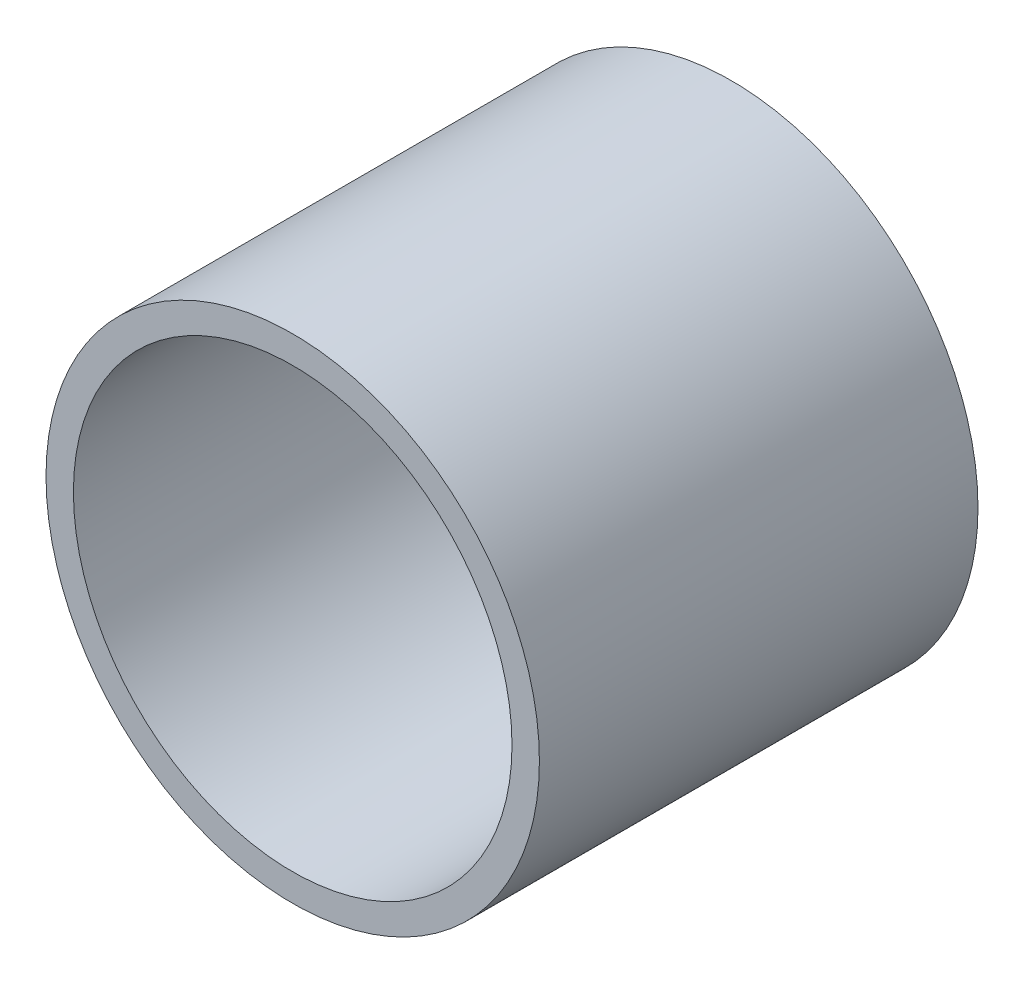
ISO-10303-21;
HEADER;
FILE_DESCRIPTION(('STEP AP214'),'2;1');
FILE_NAME('part.step','',(''),(''),'','','');
FILE_SCHEMA(('AUTOMOTIVE_DESIGN { 1 0 10303 214 1 1 1 1 }'));
ENDSEC;
DATA;
#1=APPLICATION_CONTEXT('core data for automotive mechanical design processes');
#2=APPLICATION_PROTOCOL_DEFINITION('international standard','automotive_design',2000,#1);
#3=PRODUCT_CONTEXT('',#1,'mechanical');
#4=PRODUCT('Part','Part','',(#3));
#5=PRODUCT_RELATED_PRODUCT_CATEGORY('part','',(#4));
#6=PRODUCT_DEFINITION_FORMATION('','',#4);
#7=PRODUCT_DEFINITION_CONTEXT('part definition',#1,'design');
#8=PRODUCT_DEFINITION('design','',#6,#7);
#9=PRODUCT_DEFINITION_SHAPE('','',#8);
#10=(LENGTH_UNIT() NAMED_UNIT(*) SI_UNIT(.MILLI.,.METRE.));
#11=(NAMED_UNIT(*) PLANE_ANGLE_UNIT() SI_UNIT($,.RADIAN.));
#12=(NAMED_UNIT(*) SI_UNIT($,.STERADIAN.) SOLID_ANGLE_UNIT());
#13=UNCERTAINTY_MEASURE_WITH_UNIT(LENGTH_MEASURE(1.E-05),#10,'distance_accuracy_value','');
#14=(GEOMETRIC_REPRESENTATION_CONTEXT(3) GLOBAL_UNCERTAINTY_ASSIGNED_CONTEXT((#13)) GLOBAL_UNIT_ASSIGNED_CONTEXT((#10,
#11,#12)) REPRESENTATION_CONTEXT('',''));
#15=CARTESIAN_POINT('',(0.,0.,0.));
#16=DIRECTION('',(0.,0.,1.));
#17=DIRECTION('',(1.,0.,0.));
#18=AXIS2_PLACEMENT_3D('',#15,#16,#17);
#19=CARTESIAN_POINT('',(0.,0.,8.));
#20=DIRECTION('',(0.,0.,1.));
#21=DIRECTION('',(1.,0.,0.));
#22=AXIS2_PLACEMENT_3D('',#19,#20,#21);
#23=PLANE('',#22);
#24=CARTESIAN_POINT('',(0.,0.,8.));
#25=DIRECTION('',(0.,0.,1.));
#26=DIRECTION('',(1.,0.,0.));
#27=AXIS2_PLACEMENT_3D('',#24,#25,#26);
#28=CIRCLE('',#27,4.5);
#29=CARTESIAN_POINT('',(4.5,0.,8.));
#30=VERTEX_POINT('',#29);
#31=EDGE_CURVE('E10',#30,#30,#28,.T.);
#32=ORIENTED_EDGE('',*,*,#31,.T.);
#33=EDGE_LOOP('',(#32));
#34=FACE_BOUND('',#33,.T.);
#35=CARTESIAN_POINT('',(0.,0.,8.));
#36=DIRECTION('',(0.,0.,1.));
#37=DIRECTION('',(1.,0.,0.));
#38=AXIS2_PLACEMENT_3D('',#35,#36,#37);
#39=CIRCLE('',#38,4.);
#40=CARTESIAN_POINT('',(4.,0.,8.));
#41=VERTEX_POINT('',#40);
#42=EDGE_CURVE('E41',#41,#41,#39,.T.);
#43=ORIENTED_EDGE('',*,*,#42,.F.);
#44=EDGE_LOOP('',(#43));
#45=FACE_BOUND('',#44,.T.);
#46=ADVANCED_FACE('F30',(#34,#45),#23,.T.);
#47=CARTESIAN_POINT('',(0.,0.,0.));
#48=DIRECTION('',(0.,0.,1.));
#49=DIRECTION('',(1.,0.,0.));
#50=AXIS2_PLACEMENT_3D('',#47,#48,#49);
#51=PLANE('',#50);
#52=CARTESIAN_POINT('',(0.,0.,0.));
#53=DIRECTION('',(0.,0.,1.));
#54=DIRECTION('',(1.,0.,0.));
#55=AXIS2_PLACEMENT_3D('',#52,#53,#54);
#56=CIRCLE('',#55,4.5);
#57=CARTESIAN_POINT('',(4.5,0.,0.));
#58=VERTEX_POINT('',#57);
#59=EDGE_CURVE('E34',#58,#58,#56,.T.);
#60=ORIENTED_EDGE('',*,*,#59,.F.);
#61=EDGE_LOOP('',(#60));
#62=FACE_BOUND('',#61,.T.);
#63=CARTESIAN_POINT('',(0.,0.,0.));
#64=DIRECTION('',(0.,0.,1.));
#65=DIRECTION('',(1.,0.,0.));
#66=AXIS2_PLACEMENT_3D('',#63,#64,#65);
#67=CIRCLE('',#66,4.);
#68=CARTESIAN_POINT('',(4.,0.,0.));
#69=VERTEX_POINT('',#68);
#70=EDGE_CURVE('E43',#69,#69,#67,.T.);
#71=ORIENTED_EDGE('',*,*,#70,.T.);
#72=EDGE_LOOP('',(#71));
#73=FACE_BOUND('',#72,.T.);
#74=ADVANCED_FACE('F53',(#62,#73),#51,.F.);
#75=CARTESIAN_POINT('',(0.,0.,8.));
#76=DIRECTION('',(0.,0.,-1.));
#77=DIRECTION('',(-1.,0.,0.));
#78=AXIS2_PLACEMENT_3D('',#75,#76,#77);
#79=CYLINDRICAL_SURFACE('',#78,4.5);
#80=ORIENTED_EDGE('',*,*,#31,.F.);
#81=EDGE_LOOP('',(#80));
#82=FACE_BOUND('',#81,.T.);
#83=ORIENTED_EDGE('',*,*,#59,.T.);
#84=EDGE_LOOP('',(#83));
#85=FACE_BOUND('',#84,.T.);
#86=ADVANCED_FACE('F32',(#82,#85),#79,.T.);
#87=CARTESIAN_POINT('',(0.,0.,8.));
#88=DIRECTION('',(0.,0.,-1.));
#89=DIRECTION('',(-1.,0.,0.));
#90=AXIS2_PLACEMENT_3D('',#87,#88,#89);
#91=CYLINDRICAL_SURFACE('',#90,4.);
#92=ORIENTED_EDGE('',*,*,#42,.T.);
#93=EDGE_LOOP('',(#92));
#94=FACE_BOUND('',#93,.T.);
#95=ORIENTED_EDGE('',*,*,#70,.F.);
#96=EDGE_LOOP('',(#95));
#97=FACE_BOUND('',#96,.T.);
#98=ADVANCED_FACE('F49',(#94,#97),#91,.F.);
#99=CLOSED_SHELL('',(#46,#74,#86,#98));
#100=MANIFOLD_SOLID_BREP('B2',#99);
#101=ADVANCED_BREP_SHAPE_REPRESENTATION('',(#18,#100),#14);
#102=SHAPE_DEFINITION_REPRESENTATION(#9,#101);
ENDSEC;
END-ISO-10303-21;
